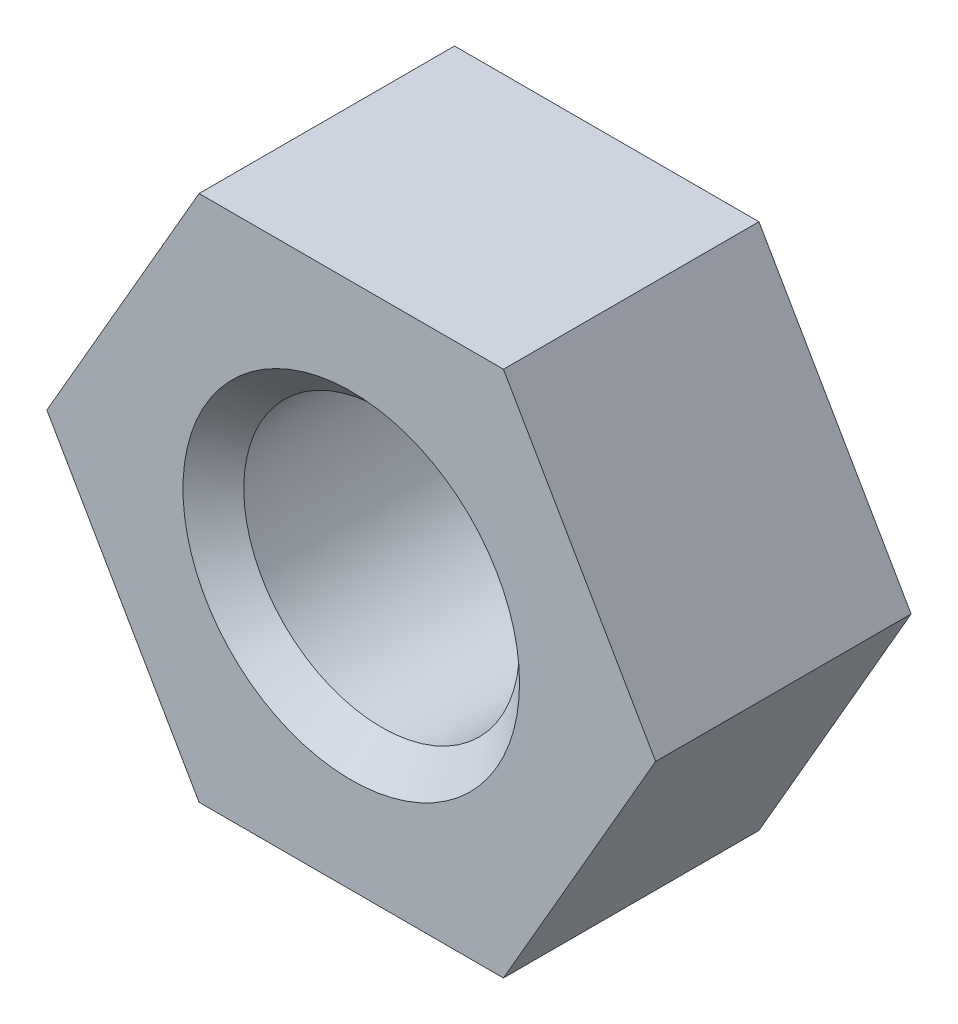
ISO-10303-21;
HEADER;
FILE_DESCRIPTION(('STEP AP214'),'2;1');
FILE_NAME('part.step','',(''),(''),'','','');
FILE_SCHEMA(('AUTOMOTIVE_DESIGN { 1 0 10303 214 1 1 1 1 }'));
ENDSEC;
DATA;
#1=APPLICATION_CONTEXT('core data for automotive mechanical design processes');
#2=APPLICATION_PROTOCOL_DEFINITION('international standard','automotive_design',2000,#1);
#3=PRODUCT_CONTEXT('',#1,'mechanical');
#4=PRODUCT('Part','Part','',(#3));
#5=PRODUCT_RELATED_PRODUCT_CATEGORY('part','',(#4));
#6=PRODUCT_DEFINITION_FORMATION('','',#4);
#7=PRODUCT_DEFINITION_CONTEXT('part definition',#1,'design');
#8=PRODUCT_DEFINITION('design','',#6,#7);
#9=PRODUCT_DEFINITION_SHAPE('','',#8);
#10=(LENGTH_UNIT() NAMED_UNIT(*) SI_UNIT(.MILLI.,.METRE.));
#11=(NAMED_UNIT(*) PLANE_ANGLE_UNIT() SI_UNIT($,.RADIAN.));
#12=(NAMED_UNIT(*) SI_UNIT($,.STERADIAN.) SOLID_ANGLE_UNIT());
#13=UNCERTAINTY_MEASURE_WITH_UNIT(LENGTH_MEASURE(1.E-05),#10,'distance_accuracy_value','');
#14=(GEOMETRIC_REPRESENTATION_CONTEXT(3) GLOBAL_UNCERTAINTY_ASSIGNED_CONTEXT((#13)) GLOBAL_UNIT_ASSIGNED_CONTEXT((#10,
#11,#12)) REPRESENTATION_CONTEXT('',''));
#15=CARTESIAN_POINT('',(0.,0.,0.));
#16=DIRECTION('',(0.,0.,1.));
#17=DIRECTION('',(1.,0.,0.));
#18=AXIS2_PLACEMENT_3D('',#15,#16,#17);
#19=CARTESIAN_POINT('',(0.,0.,6.3));
#20=DIRECTION('',(0.,0.,1.));
#21=DIRECTION('',(1.,0.,0.));
#22=AXIS2_PLACEMENT_3D('',#19,#20,#21);
#23=PLANE('',#22);
#24=CARTESIAN_POINT('',(0.,0.,6.3));
#25=DIRECTION('',(0.,0.,1.));
#26=DIRECTION('',(1.,0.,0.));
#27=AXIS2_PLACEMENT_3D('',#24,#25,#26);
#28=CIRCLE('',#27,4.15000000000001);
#29=CARTESIAN_POINT('',(4.15000000000001,0.,6.3));
#30=VERTEX_POINT('',#29);
#31=EDGE_CURVE('E11',#30,#30,#28,.F.);
#32=ORIENTED_EDGE('',*,*,#31,.T.);
#33=EDGE_LOOP('',(#32));
#34=FACE_BOUND('',#33,.T.);
#35=DIRECTION('',(0.5,0.866025403784438,0.));
#36=VECTOR('',#35,1.);
#37=CARTESIAN_POINT('',(3.75277674973257,-6.5,6.3));
#38=LINE('',#37,#36);
#39=CARTESIAN_POINT('',(3.75277674973257,-6.5,6.3));
#40=VERTEX_POINT('',#39);
#41=CARTESIAN_POINT('',(7.50555349946514,0.,6.3));
#42=VERTEX_POINT('',#41);
#43=EDGE_CURVE('E127',#40,#42,#38,.T.);
#44=ORIENTED_EDGE('',*,*,#43,.T.);
#45=DIRECTION('',(-0.5,0.866025403784439,0.));
#46=VECTOR('',#45,1.);
#47=CARTESIAN_POINT('',(7.50555349946514,0.,6.3));
#48=LINE('',#47,#46);
#49=CARTESIAN_POINT('',(3.75277674973257,6.5,6.3));
#50=VERTEX_POINT('',#49);
#51=EDGE_CURVE('E87',#42,#50,#48,.T.);
#52=ORIENTED_EDGE('',*,*,#51,.T.);
#53=DIRECTION('',(-1.,0.,0.));
#54=VECTOR('',#53,1.);
#55=CARTESIAN_POINT('',(3.75277674973257,6.5,6.3));
#56=LINE('',#55,#54);
#57=CARTESIAN_POINT('',(-3.75277674973257,6.5,6.3));
#58=VERTEX_POINT('',#57);
#59=EDGE_CURVE('E99',#50,#58,#56,.T.);
#60=ORIENTED_EDGE('',*,*,#59,.T.);
#61=DIRECTION('',(-0.5,-0.866025403784438,0.));
#62=VECTOR('',#61,1.);
#63=CARTESIAN_POINT('',(-3.75277674973257,6.5,6.3));
#64=LINE('',#63,#62);
#65=CARTESIAN_POINT('',(-7.50555349946514,0.,6.3));
#66=VERTEX_POINT('',#65);
#67=EDGE_CURVE('E94',#58,#66,#64,.T.);
#68=ORIENTED_EDGE('',*,*,#67,.T.);
#69=DIRECTION('',(0.5,-0.866025403784439,0.));
#70=VECTOR('',#69,1.);
#71=CARTESIAN_POINT('',(-7.50555349946514,0.,6.3));
#72=LINE('',#71,#70);
#73=CARTESIAN_POINT('',(-3.75277674973257,-6.5,6.3));
#74=VERTEX_POINT('',#73);
#75=EDGE_CURVE('E97',#66,#74,#72,.T.);
#76=ORIENTED_EDGE('',*,*,#75,.T.);
#77=DIRECTION('',(1.,0.,0.));
#78=VECTOR('',#77,1.);
#79=CARTESIAN_POINT('',(-3.75277674973257,-6.5,6.3));
#80=LINE('',#79,#78);
#81=EDGE_CURVE('E49',#74,#40,#80,.T.);
#82=ORIENTED_EDGE('',*,*,#81,.T.);
#83=EDGE_LOOP('',(#44,#52,#60,#68,#76,#82));
#84=FACE_BOUND('',#83,.T.);
#85=ADVANCED_FACE('F32',(#34,#84),#23,.T.);
#86=CARTESIAN_POINT('',(0.,0.,0.));
#87=DIRECTION('',(0.,0.,1.));
#88=DIRECTION('',(1.,0.,0.));
#89=AXIS2_PLACEMENT_3D('',#86,#87,#88);
#90=PLANE('',#89);
#91=CARTESIAN_POINT('',(0.,0.,0.));
#92=DIRECTION('',(0.,0.,1.));
#93=DIRECTION('',(1.,0.,0.));
#94=AXIS2_PLACEMENT_3D('',#91,#92,#93);
#95=CIRCLE('',#94,4.15);
#96=CARTESIAN_POINT('',(4.15,0.,0.));
#97=VERTEX_POINT('',#96);
#98=EDGE_CURVE('E136',#97,#97,#95,.T.);
#99=ORIENTED_EDGE('',*,*,#98,.T.);
#100=EDGE_LOOP('',(#99));
#101=FACE_BOUND('',#100,.T.);
#102=DIRECTION('',(0.5,0.866025403784438,0.));
#103=VECTOR('',#102,1.);
#104=CARTESIAN_POINT('',(3.75277674973257,-6.5,0.));
#105=LINE('',#104,#103);
#106=CARTESIAN_POINT('',(3.75277674973257,-6.5,0.));
#107=VERTEX_POINT('',#106);
#108=CARTESIAN_POINT('',(7.50555349946514,0.,0.));
#109=VERTEX_POINT('',#108);
#110=EDGE_CURVE('E117',#107,#109,#105,.T.);
#111=ORIENTED_EDGE('',*,*,#110,.F.);
#112=DIRECTION('',(1.,0.,0.));
#113=VECTOR('',#112,1.);
#114=CARTESIAN_POINT('',(-3.75277674973257,-6.5,0.));
#115=LINE('',#114,#113);
#116=CARTESIAN_POINT('',(-3.75277674973257,-6.5,0.));
#117=VERTEX_POINT('',#116);
#118=EDGE_CURVE('E78',#117,#107,#115,.T.);
#119=ORIENTED_EDGE('',*,*,#118,.F.);
#120=DIRECTION('',(0.5,-0.866025403784439,0.));
#121=VECTOR('',#120,1.);
#122=CARTESIAN_POINT('',(-7.50555349946514,0.,0.));
#123=LINE('',#122,#121);
#124=CARTESIAN_POINT('',(-7.50555349946514,0.,0.));
#125=VERTEX_POINT('',#124);
#126=EDGE_CURVE('E72',#125,#117,#123,.T.);
#127=ORIENTED_EDGE('',*,*,#126,.F.);
#128=DIRECTION('',(-0.5,-0.866025403784438,0.));
#129=VECTOR('',#128,1.);
#130=CARTESIAN_POINT('',(-3.75277674973257,6.5,0.));
#131=LINE('',#130,#129);
#132=CARTESIAN_POINT('',(-3.75277674973257,6.5,0.));
#133=VERTEX_POINT('',#132);
#134=EDGE_CURVE('E107',#133,#125,#131,.T.);
#135=ORIENTED_EDGE('',*,*,#134,.F.);
#136=DIRECTION('',(-1.,0.,0.));
#137=VECTOR('',#136,1.);
#138=CARTESIAN_POINT('',(3.75277674973257,6.5,0.));
#139=LINE('',#138,#137);
#140=CARTESIAN_POINT('',(3.75277674973257,6.5,0.));
#141=VERTEX_POINT('',#140);
#142=EDGE_CURVE('E122',#141,#133,#139,.T.);
#143=ORIENTED_EDGE('',*,*,#142,.F.);
#144=DIRECTION('',(-0.5,0.866025403784439,0.));
#145=VECTOR('',#144,1.);
#146=CARTESIAN_POINT('',(7.50555349946514,0.,0.));
#147=LINE('',#146,#145);
#148=EDGE_CURVE('E120',#109,#141,#147,.T.);
#149=ORIENTED_EDGE('',*,*,#148,.F.);
#150=EDGE_LOOP('',(#111,#119,#127,#135,#143,#149));
#151=FACE_BOUND('',#150,.T.);
#152=ADVANCED_FACE('F152',(#101,#151),#90,.F.);
#153=CARTESIAN_POINT('',(3.75277674973257,-6.5,6.3));
#154=DIRECTION('',(-0.866025403784439,0.5,0.));
#155=DIRECTION('',(-0.5,-0.866025403784439,0.));
#156=AXIS2_PLACEMENT_3D('',#153,#154,#155);
#157=PLANE('',#156);
#158=ORIENTED_EDGE('',*,*,#110,.T.);
#159=DIRECTION('',(0.,0.,-1.));
#160=VECTOR('',#159,1.);
#161=CARTESIAN_POINT('',(7.50555349946514,0.,6.3));
#162=LINE('',#161,#160);
#163=EDGE_CURVE('E134',#42,#109,#162,.T.);
#164=ORIENTED_EDGE('',*,*,#163,.F.);
#165=ORIENTED_EDGE('',*,*,#43,.F.);
#166=DIRECTION('',(0.,0.,-1.));
#167=VECTOR('',#166,1.);
#168=CARTESIAN_POINT('',(3.75277674973257,-6.5,6.3));
#169=LINE('',#168,#167);
#170=EDGE_CURVE('E113',#40,#107,#169,.T.);
#171=ORIENTED_EDGE('',*,*,#170,.T.);
#172=EDGE_LOOP('',(#158,#164,#165,#171));
#173=FACE_BOUND('',#172,.T.);
#174=ADVANCED_FACE('F155',(#173),#157,.F.);
#175=CARTESIAN_POINT('',(7.50555349946514,0.,6.3));
#176=DIRECTION('',(-0.866025403784439,-0.5,0.));
#177=DIRECTION('',(0.5,-0.866025403784439,0.));
#178=AXIS2_PLACEMENT_3D('',#175,#176,#177);
#179=PLANE('',#178);
#180=ORIENTED_EDGE('',*,*,#148,.T.);
#181=DIRECTION('',(0.,0.,-1.));
#182=VECTOR('',#181,1.);
#183=CARTESIAN_POINT('',(3.75277674973257,6.5,6.3));
#184=LINE('',#183,#182);
#185=EDGE_CURVE('E131',#50,#141,#184,.T.);
#186=ORIENTED_EDGE('',*,*,#185,.F.);
#187=ORIENTED_EDGE('',*,*,#51,.F.);
#188=ORIENTED_EDGE('',*,*,#163,.T.);
#189=EDGE_LOOP('',(#180,#186,#187,#188));
#190=FACE_BOUND('',#189,.T.);
#191=ADVANCED_FACE('F231',(#190),#179,.F.);
#192=CARTESIAN_POINT('',(3.75277674973257,6.5,6.3));
#193=DIRECTION('',(0.,-1.,0.));
#194=DIRECTION('',(1.,0.,0.));
#195=AXIS2_PLACEMENT_3D('',#192,#193,#194);
#196=PLANE('',#195);
#197=ORIENTED_EDGE('',*,*,#142,.T.);
#198=DIRECTION('',(0.,0.,-1.));
#199=VECTOR('',#198,1.);
#200=CARTESIAN_POINT('',(-3.75277674973257,6.5,6.3));
#201=LINE('',#200,#199);
#202=EDGE_CURVE('E108',#58,#133,#201,.T.);
#203=ORIENTED_EDGE('',*,*,#202,.F.);
#204=ORIENTED_EDGE('',*,*,#59,.F.);
#205=ORIENTED_EDGE('',*,*,#185,.T.);
#206=EDGE_LOOP('',(#197,#203,#204,#205));
#207=FACE_BOUND('',#206,.T.);
#208=ADVANCED_FACE('F222',(#207),#196,.F.);
#209=CARTESIAN_POINT('',(-3.75277674973257,6.5,6.3));
#210=DIRECTION('',(0.866025403784439,-0.5,0.));
#211=DIRECTION('',(0.5,0.866025403784439,0.));
#212=AXIS2_PLACEMENT_3D('',#209,#210,#211);
#213=PLANE('',#212);
#214=ORIENTED_EDGE('',*,*,#134,.T.);
#215=DIRECTION('',(0.,0.,-1.));
#216=VECTOR('',#215,1.);
#217=CARTESIAN_POINT('',(-7.50555349946514,0.,6.3));
#218=LINE('',#217,#216);
#219=EDGE_CURVE('E104',#66,#125,#218,.T.);
#220=ORIENTED_EDGE('',*,*,#219,.F.);
#221=ORIENTED_EDGE('',*,*,#67,.F.);
#222=ORIENTED_EDGE('',*,*,#202,.T.);
#223=EDGE_LOOP('',(#214,#220,#221,#222));
#224=FACE_BOUND('',#223,.T.);
#225=ADVANCED_FACE('F105',(#224),#213,.F.);
#226=CARTESIAN_POINT('',(-7.50555349946514,0.,6.3));
#227=DIRECTION('',(0.866025403784439,0.5,0.));
#228=DIRECTION('',(-0.5,0.866025403784439,0.));
#229=AXIS2_PLACEMENT_3D('',#226,#227,#228);
#230=PLANE('',#229);
#231=ORIENTED_EDGE('',*,*,#126,.T.);
#232=DIRECTION('',(0.,0.,-1.));
#233=VECTOR('',#232,1.);
#234=CARTESIAN_POINT('',(-3.75277674973257,-6.5,6.3));
#235=LINE('',#234,#233);
#236=EDGE_CURVE('E109',#74,#117,#235,.T.);
#237=ORIENTED_EDGE('',*,*,#236,.F.);
#238=ORIENTED_EDGE('',*,*,#75,.F.);
#239=ORIENTED_EDGE('',*,*,#219,.T.);
#240=EDGE_LOOP('',(#231,#237,#238,#239));
#241=FACE_BOUND('',#240,.T.);
#242=ADVANCED_FACE('F111',(#241),#230,.F.);
#243=CARTESIAN_POINT('',(-3.75277674973257,-6.5,6.3));
#244=DIRECTION('',(0.,1.,0.));
#245=DIRECTION('',(-1.,0.,0.));
#246=AXIS2_PLACEMENT_3D('',#243,#244,#245);
#247=PLANE('',#246);
#248=ORIENTED_EDGE('',*,*,#118,.T.);
#249=ORIENTED_EDGE('',*,*,#170,.F.);
#250=ORIENTED_EDGE('',*,*,#81,.F.);
#251=ORIENTED_EDGE('',*,*,#236,.T.);
#252=EDGE_LOOP('',(#248,#249,#250,#251));
#253=FACE_BOUND('',#252,.T.);
#254=ADVANCED_FACE('F162',(#253),#247,.F.);
#255=CARTESIAN_POINT('',(0.,0.,6.3));
#256=DIRECTION('',(0.,0.,-1.));
#257=DIRECTION('',(-1.,0.,0.));
#258=AXIS2_PLACEMENT_3D('',#255,#256,#257);
#259=CYLINDRICAL_SURFACE('',#258,3.4);
#260=CARTESIAN_POINT('',(0.,0.,0.750000000000005));
#261=DIRECTION('',(0.,0.,1.));
#262=DIRECTION('',(1.,0.,0.));
#263=AXIS2_PLACEMENT_3D('',#260,#261,#262);
#264=CIRCLE('',#263,3.4);
#265=CARTESIAN_POINT('',(3.4,0.,0.750000000000005));
#266=VERTEX_POINT('',#265);
#267=EDGE_CURVE('E41',#266,#266,#264,.F.);
#268=ORIENTED_EDGE('',*,*,#267,.T.);
#269=EDGE_LOOP('',(#268));
#270=FACE_BOUND('',#269,.T.);
#271=CARTESIAN_POINT('',(0.,0.,5.55));
#272=DIRECTION('',(0.,0.,1.));
#273=DIRECTION('',(1.,0.,0.));
#274=AXIS2_PLACEMENT_3D('',#271,#272,#273);
#275=CIRCLE('',#274,3.4);
#276=CARTESIAN_POINT('',(3.4,0.,5.55));
#277=VERTEX_POINT('',#276);
#278=EDGE_CURVE('E139',#277,#277,#275,.T.);
#279=ORIENTED_EDGE('',*,*,#278,.T.);
#280=EDGE_LOOP('',(#279));
#281=FACE_BOUND('',#280,.T.);
#282=ADVANCED_FACE('F144',(#270,#281),#259,.F.);
#283=CARTESIAN_POINT('',(0.,0.,0.));
#284=DIRECTION('',(0.,0.,-1.));
#285=DIRECTION('',(-1.,0.,0.));
#286=AXIS2_PLACEMENT_3D('',#283,#284,#285);
#287=CONICAL_SURFACE('',#286,4.15,0.785398163397447);
#288=ORIENTED_EDGE('',*,*,#267,.F.);
#289=EDGE_LOOP('',(#288));
#290=FACE_BOUND('',#289,.T.);
#291=ORIENTED_EDGE('',*,*,#98,.F.);
#292=EDGE_LOOP('',(#291));
#293=FACE_BOUND('',#292,.T.);
#294=ADVANCED_FACE('F147',(#290,#293),#287,.F.);
#295=CARTESIAN_POINT('',(0.,0.,5.55));
#296=DIRECTION('',(0.,0.,1.));
#297=DIRECTION('',(1.,0.,0.));
#298=AXIS2_PLACEMENT_3D('',#295,#296,#297);
#299=CONICAL_SURFACE('',#298,3.4,0.785398163397451);
#300=ORIENTED_EDGE('',*,*,#31,.F.);
#301=EDGE_LOOP('',(#300));
#302=FACE_BOUND('',#301,.T.);
#303=ORIENTED_EDGE('',*,*,#278,.F.);
#304=EDGE_LOOP('',(#303));
#305=FACE_BOUND('',#304,.T.);
#306=ADVANCED_FACE('F34',(#302,#305),#299,.F.);
#307=CLOSED_SHELL('',(#85,#152,#174,#191,#208,#225,#242,#254,#282,#294,#306));
#308=MANIFOLD_SOLID_BREP('B2',#307);
#309=ADVANCED_BREP_SHAPE_REPRESENTATION('',(#18,#308),#14);
#310=SHAPE_DEFINITION_REPRESENTATION(#9,#309);
ENDSEC;
END-ISO-10303-21;
